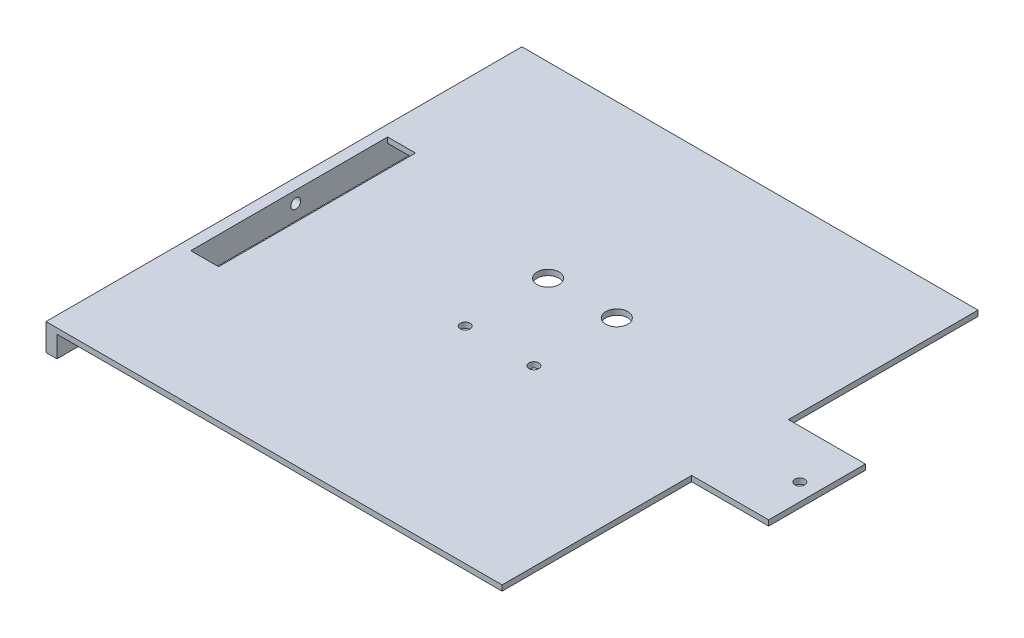
ISO-10303-21;
HEADER;
FILE_DESCRIPTION(('STEP AP214'),'2;1');
FILE_NAME('part.step','',(''),(''),'','','');
FILE_SCHEMA(('AUTOMOTIVE_DESIGN { 1 0 10303 214 1 1 1 1 }'));
ENDSEC;
DATA;
#1=APPLICATION_CONTEXT('core data for automotive mechanical design processes');
#2=APPLICATION_PROTOCOL_DEFINITION('international standard','automotive_design',2000,#1);
#3=PRODUCT_CONTEXT('',#1,'mechanical');
#4=PRODUCT('Part','Part','',(#3));
#5=PRODUCT_RELATED_PRODUCT_CATEGORY('part','',(#4));
#6=PRODUCT_DEFINITION_FORMATION('','',#4);
#7=PRODUCT_DEFINITION_CONTEXT('part definition',#1,'design');
#8=PRODUCT_DEFINITION('design','',#6,#7);
#9=PRODUCT_DEFINITION_SHAPE('','',#8);
#10=(LENGTH_UNIT() NAMED_UNIT(*) SI_UNIT(.MILLI.,.METRE.));
#11=(NAMED_UNIT(*) PLANE_ANGLE_UNIT() SI_UNIT($,.RADIAN.));
#12=(NAMED_UNIT(*) SI_UNIT($,.STERADIAN.) SOLID_ANGLE_UNIT());
#13=UNCERTAINTY_MEASURE_WITH_UNIT(LENGTH_MEASURE(1.E-05),#10,'distance_accuracy_value','');
#14=(GEOMETRIC_REPRESENTATION_CONTEXT(3) GLOBAL_UNCERTAINTY_ASSIGNED_CONTEXT((#13)) GLOBAL_UNIT_ASSIGNED_CONTEXT((#10,
#11,#12)) REPRESENTATION_CONTEXT('',''));
#15=CARTESIAN_POINT('',(0.,0.,0.));
#16=DIRECTION('',(0.,0.,1.));
#17=DIRECTION('',(1.,0.,0.));
#18=AXIS2_PLACEMENT_3D('',#15,#16,#17);
#19=CARTESIAN_POINT('',(-46.9072978588514,0.,24.0778583748593));
#20=DIRECTION('',(0.,0.,-1.));
#21=DIRECTION('',(-1.,0.,0.));
#22=AXIS2_PLACEMENT_3D('',#19,#20,#21);
#23=PLANE('',#22);
#24=DIRECTION('',(-1.,0.,0.));
#25=VECTOR('',#24,1.);
#26=CARTESIAN_POINT('',(-46.9072978588514,0.,24.0778583748593));
#27=LINE('',#26,#25);
#28=CARTESIAN_POINT('',(-46.9072978588514,0.,24.0778583748593));
#29=VERTEX_POINT('',#28);
#30=CARTESIAN_POINT('',(-53.34,0.,24.0778583748593));
#31=VERTEX_POINT('',#30);
#32=EDGE_CURVE('E200',#29,#31,#27,.T.);
#33=ORIENTED_EDGE('',*,*,#32,.T.);
#34=DIRECTION('',(0.,-1.,0.));
#35=VECTOR('',#34,1.);
#36=CARTESIAN_POINT('',(-53.34,0.,24.0778583748593));
#37=LINE('',#36,#35);
#38=CARTESIAN_POINT('',(-53.34,1.27,24.0778583748593));
#39=VERTEX_POINT('',#38);
#40=EDGE_CURVE('E243',#39,#31,#37,.T.);
#41=ORIENTED_EDGE('',*,*,#40,.F.);
#42=DIRECTION('',(1.,0.,0.));
#43=VECTOR('',#42,1.);
#44=CARTESIAN_POINT('',(0.,1.27,24.0778583748593));
#45=LINE('',#44,#43);
#46=CARTESIAN_POINT('',(-46.9072978588514,1.27,24.0778583748593));
#47=VERTEX_POINT('',#46);
#48=EDGE_CURVE('E163',#47,#39,#45,.F.);
#49=ORIENTED_EDGE('',*,*,#48,.F.);
#50=DIRECTION('',(0.,-1.,0.));
#51=VECTOR('',#50,1.);
#52=CARTESIAN_POINT('',(-46.9072978588514,0.,24.0778583748593));
#53=LINE('',#52,#51);
#54=EDGE_CURVE('E11',#47,#29,#53,.T.);
#55=ORIENTED_EDGE('',*,*,#54,.T.);
#56=EDGE_LOOP('',(#33,#41,#49,#55));
#57=FACE_BOUND('',#56,.T.);
#58=ADVANCED_FACE('F36',(#57),#23,.T.);
#59=CARTESIAN_POINT('',(-46.9072978588514,0.,-21.4333957618678));
#60=DIRECTION('',(-1.,0.,0.));
#61=DIRECTION('',(0.,0.,1.));
#62=AXIS2_PLACEMENT_3D('',#59,#60,#61);
#63=PLANE('',#62);
#64=ORIENTED_EDGE('',*,*,#54,.F.);
#65=DIRECTION('',(0.,0.,1.));
#66=VECTOR('',#65,1.);
#67=CARTESIAN_POINT('',(-46.9072978588514,1.27,0.));
#68=LINE('',#67,#66);
#69=CARTESIAN_POINT('',(-46.9072978588514,1.27,-21.4333957618678));
#70=VERTEX_POINT('',#69);
#71=EDGE_CURVE('E182',#70,#47,#68,.T.);
#72=ORIENTED_EDGE('',*,*,#71,.F.);
#73=DIRECTION('',(0.,-1.,0.));
#74=VECTOR('',#73,1.);
#75=CARTESIAN_POINT('',(-46.9072978588514,0.,-21.4333957618678));
#76=LINE('',#75,#74);
#77=CARTESIAN_POINT('',(-46.9072978588514,0.,-21.4333957618678));
#78=VERTEX_POINT('',#77);
#79=EDGE_CURVE('E44',#70,#78,#76,.T.);
#80=ORIENTED_EDGE('',*,*,#79,.T.);
#81=DIRECTION('',(0.,0.,1.));
#82=VECTOR('',#81,1.);
#83=CARTESIAN_POINT('',(-46.9072978588514,0.,-21.4333957618678));
#84=LINE('',#83,#82);
#85=EDGE_CURVE('E194',#78,#29,#84,.T.);
#86=ORIENTED_EDGE('',*,*,#85,.T.);
#87=EDGE_LOOP('',(#64,#72,#80,#86));
#88=FACE_BOUND('',#87,.T.);
#89=ADVANCED_FACE('F193',(#88),#63,.T.);
#90=CARTESIAN_POINT('',(-49.53,0.,-21.4333957618678));
#91=DIRECTION('',(0.,0.,1.));
#92=DIRECTION('',(1.,0.,0.));
#93=AXIS2_PLACEMENT_3D('',#90,#91,#92);
#94=PLANE('',#93);
#95=ORIENTED_EDGE('',*,*,#79,.F.);
#96=DIRECTION('',(1.,0.,0.));
#97=VECTOR('',#96,1.);
#98=CARTESIAN_POINT('',(0.,1.27,-21.4333957618678));
#99=LINE('',#98,#97);
#100=CARTESIAN_POINT('',(-53.34,1.27,-21.4333957618678));
#101=VERTEX_POINT('',#100);
#102=EDGE_CURVE('E180',#101,#70,#99,.T.);
#103=ORIENTED_EDGE('',*,*,#102,.F.);
#104=DIRECTION('',(0.,1.,0.));
#105=VECTOR('',#104,1.);
#106=CARTESIAN_POINT('',(-53.34,0.,-21.4333957618678));
#107=LINE('',#106,#105);
#108=CARTESIAN_POINT('',(-53.34,0.,-21.4333957618678));
#109=VERTEX_POINT('',#108);
#110=EDGE_CURVE('E204',#109,#101,#107,.T.);
#111=ORIENTED_EDGE('',*,*,#110,.F.);
#112=DIRECTION('',(1.,0.,0.));
#113=VECTOR('',#112,1.);
#114=CARTESIAN_POINT('',(-49.53,0.,-21.4333957618678));
#115=LINE('',#114,#113);
#116=EDGE_CURVE('E198',#109,#78,#115,.T.);
#117=ORIENTED_EDGE('',*,*,#116,.T.);
#118=EDGE_LOOP('',(#95,#103,#111,#117));
#119=FACE_BOUND('',#118,.T.);
#120=ADVANCED_FACE('F202',(#119),#94,.T.);
#121=CARTESIAN_POINT('',(-49.53,0.,-54.991));
#122=DIRECTION('',(0.,0.,-1.));
#123=DIRECTION('',(-1.,0.,0.));
#124=AXIS2_PLACEMENT_3D('',#121,#122,#123);
#125=PLANE('',#124);
#126=DIRECTION('',(-1.,0.,0.));
#127=VECTOR('',#126,1.);
#128=CARTESIAN_POINT('',(-49.53,0.,-54.991));
#129=LINE('',#128,#127);
#130=CARTESIAN_POINT('',(49.53,0.,-54.991));
#131=VERTEX_POINT('',#130);
#132=CARTESIAN_POINT('',(-53.34,0.,-54.991));
#133=VERTEX_POINT('',#132);
#134=EDGE_CURVE('E206',#131,#133,#129,.T.);
#135=ORIENTED_EDGE('',*,*,#134,.T.);
#136=DIRECTION('',(0.,-1.,0.));
#137=VECTOR('',#136,1.);
#138=CARTESIAN_POINT('',(-53.34,1.27,-54.991));
#139=LINE('',#138,#137);
#140=CARTESIAN_POINT('',(-53.34,-4.93411036519831,-54.991));
#141=VERTEX_POINT('',#140);
#142=EDGE_CURVE('E280',#133,#141,#139,.T.);
#143=ORIENTED_EDGE('',*,*,#142,.T.);
#144=DIRECTION('',(1.,0.,0.));
#145=VECTOR('',#144,1.);
#146=CARTESIAN_POINT('',(-55.88,-4.93411036519831,-54.991));
#147=LINE('',#146,#145);
#148=CARTESIAN_POINT('',(-55.88,-4.93411036519831,-54.991));
#149=VERTEX_POINT('',#148);
#150=EDGE_CURVE('E296',#149,#141,#147,.T.);
#151=ORIENTED_EDGE('',*,*,#150,.F.);
#152=DIRECTION('',(0.,-1.,0.));
#153=VECTOR('',#152,1.);
#154=CARTESIAN_POINT('',(-55.88,1.27,-54.991));
#155=LINE('',#154,#153);
#156=CARTESIAN_POINT('',(-55.88,1.27,-54.991));
#157=VERTEX_POINT('',#156);
#158=EDGE_CURVE('E325',#157,#149,#155,.T.);
#159=ORIENTED_EDGE('',*,*,#158,.F.);
#160=DIRECTION('',(1.,0.,0.));
#161=VECTOR('',#160,1.);
#162=CARTESIAN_POINT('',(0.,1.27,-54.991));
#163=LINE('',#162,#161);
#164=CARTESIAN_POINT('',(49.53,1.27,-54.991));
#165=VERTEX_POINT('',#164);
#166=EDGE_CURVE('E177',#165,#157,#163,.F.);
#167=ORIENTED_EDGE('',*,*,#166,.F.);
#168=DIRECTION('',(0.,-1.,0.));
#169=VECTOR('',#168,1.);
#170=CARTESIAN_POINT('',(49.53,0.,-54.991));
#171=LINE('',#170,#169);
#172=EDGE_CURVE('E191',#165,#131,#171,.T.);
#173=ORIENTED_EDGE('',*,*,#172,.T.);
#174=EDGE_LOOP('',(#135,#143,#151,#159,#167,#173));
#175=FACE_BOUND('',#174,.T.);
#176=ADVANCED_FACE('F333',(#175),#125,.T.);
#177=CARTESIAN_POINT('',(49.53,0.,-11.176));
#178=DIRECTION('',(1.,0.,0.));
#179=DIRECTION('',(0.,0.,-1.));
#180=AXIS2_PLACEMENT_3D('',#177,#178,#179);
#181=PLANE('',#180);
#182=ORIENTED_EDGE('',*,*,#172,.F.);
#183=DIRECTION('',(0.,0.,1.));
#184=VECTOR('',#183,1.);
#185=CARTESIAN_POINT('',(49.53,1.27,0.));
#186=LINE('',#185,#184);
#187=CARTESIAN_POINT('',(49.53,1.27,-11.176));
#188=VERTEX_POINT('',#187);
#189=EDGE_CURVE('E174',#188,#165,#186,.F.);
#190=ORIENTED_EDGE('',*,*,#189,.F.);
#191=DIRECTION('',(0.,-1.,0.));
#192=VECTOR('',#191,1.);
#193=CARTESIAN_POINT('',(49.53,0.,-11.176));
#194=LINE('',#193,#192);
#195=CARTESIAN_POINT('',(49.53,0.,-11.176));
#196=VERTEX_POINT('',#195);
#197=EDGE_CURVE('E189',#188,#196,#194,.T.);
#198=ORIENTED_EDGE('',*,*,#197,.T.);
#199=DIRECTION('',(0.,0.,-1.));
#200=VECTOR('',#199,1.);
#201=CARTESIAN_POINT('',(49.53,0.,-11.176));
#202=LINE('',#201,#200);
#203=EDGE_CURVE('E209',#196,#131,#202,.T.);
#204=ORIENTED_EDGE('',*,*,#203,.T.);
#205=EDGE_LOOP('',(#182,#190,#198,#204));
#206=FACE_BOUND('',#205,.T.);
#207=ADVANCED_FACE('F442',(#206),#181,.T.);
#208=CARTESIAN_POINT('',(49.53,0.,-11.176));
#209=DIRECTION('',(0.,0.,-1.));
#210=DIRECTION('',(-1.,0.,0.));
#211=AXIS2_PLACEMENT_3D('',#208,#209,#210);
#212=PLANE('',#211);
#213=ORIENTED_EDGE('',*,*,#197,.F.);
#214=DIRECTION('',(1.,0.,0.));
#215=VECTOR('',#214,1.);
#216=CARTESIAN_POINT('',(0.,1.27,-11.176));
#217=LINE('',#216,#215);
#218=CARTESIAN_POINT('',(67.31,1.27,-11.176));
#219=VERTEX_POINT('',#218);
#220=EDGE_CURVE('E171',#219,#188,#217,.F.);
#221=ORIENTED_EDGE('',*,*,#220,.F.);
#222=DIRECTION('',(0.,-1.,0.));
#223=VECTOR('',#222,1.);
#224=CARTESIAN_POINT('',(67.31,0.,-11.176));
#225=LINE('',#224,#223);
#226=CARTESIAN_POINT('',(67.31,0.,-11.176));
#227=VERTEX_POINT('',#226);
#228=EDGE_CURVE('E127',#219,#227,#225,.T.);
#229=ORIENTED_EDGE('',*,*,#228,.T.);
#230=DIRECTION('',(-1.,0.,0.));
#231=VECTOR('',#230,1.);
#232=CARTESIAN_POINT('',(49.53,0.,-11.176));
#233=LINE('',#232,#231);
#234=EDGE_CURVE('E136',#227,#196,#233,.T.);
#235=ORIENTED_EDGE('',*,*,#234,.T.);
#236=EDGE_LOOP('',(#213,#221,#229,#235));
#237=FACE_BOUND('',#236,.T.);
#238=ADVANCED_FACE('F215',(#237),#212,.T.);
#239=CARTESIAN_POINT('',(67.31,0.,-11.176));
#240=DIRECTION('',(1.,0.,0.));
#241=DIRECTION('',(0.,0.,-1.));
#242=AXIS2_PLACEMENT_3D('',#239,#240,#241);
#243=PLANE('',#242);
#244=ORIENTED_EDGE('',*,*,#228,.F.);
#245=DIRECTION('',(0.,0.,1.));
#246=VECTOR('',#245,1.);
#247=CARTESIAN_POINT('',(67.31,1.27,0.));
#248=LINE('',#247,#246);
#249=CARTESIAN_POINT('',(67.31,1.27,11.176));
#250=VERTEX_POINT('',#249);
#251=EDGE_CURVE('E122',#250,#219,#248,.F.);
#252=ORIENTED_EDGE('',*,*,#251,.F.);
#253=DIRECTION('',(0.,-1.,0.));
#254=VECTOR('',#253,1.);
#255=CARTESIAN_POINT('',(67.31,0.,11.176));
#256=LINE('',#255,#254);
#257=CARTESIAN_POINT('',(67.31,0.,11.176));
#258=VERTEX_POINT('',#257);
#259=EDGE_CURVE('E117',#250,#258,#256,.T.);
#260=ORIENTED_EDGE('',*,*,#259,.T.);
#261=DIRECTION('',(0.,0.,-1.));
#262=VECTOR('',#261,1.);
#263=CARTESIAN_POINT('',(67.31,0.,-11.176));
#264=LINE('',#263,#262);
#265=EDGE_CURVE('E120',#258,#227,#264,.T.);
#266=ORIENTED_EDGE('',*,*,#265,.T.);
#267=EDGE_LOOP('',(#244,#252,#260,#266));
#268=FACE_BOUND('',#267,.T.);
#269=ADVANCED_FACE('F119',(#268),#243,.T.);
#270=CARTESIAN_POINT('',(67.31,0.,11.176));
#271=DIRECTION('',(0.,0.,1.));
#272=DIRECTION('',(1.,0.,0.));
#273=AXIS2_PLACEMENT_3D('',#270,#271,#272);
#274=PLANE('',#273);
#275=ORIENTED_EDGE('',*,*,#259,.F.);
#276=DIRECTION('',(1.,0.,0.));
#277=VECTOR('',#276,1.);
#278=CARTESIAN_POINT('',(0.,1.27,11.176));
#279=LINE('',#278,#277);
#280=CARTESIAN_POINT('',(49.53,1.27,11.176));
#281=VERTEX_POINT('',#280);
#282=EDGE_CURVE('E168',#281,#250,#279,.T.);
#283=ORIENTED_EDGE('',*,*,#282,.F.);
#284=DIRECTION('',(0.,-1.,0.));
#285=VECTOR('',#284,1.);
#286=CARTESIAN_POINT('',(49.53,0.,11.176));
#287=LINE('',#286,#285);
#288=CARTESIAN_POINT('',(49.53,0.,11.176));
#289=VERTEX_POINT('',#288);
#290=EDGE_CURVE('E128',#281,#289,#287,.T.);
#291=ORIENTED_EDGE('',*,*,#290,.T.);
#292=DIRECTION('',(1.,0.,0.));
#293=VECTOR('',#292,1.);
#294=CARTESIAN_POINT('',(67.31,0.,11.176));
#295=LINE('',#294,#293);
#296=EDGE_CURVE('E133',#289,#258,#295,.T.);
#297=ORIENTED_EDGE('',*,*,#296,.T.);
#298=EDGE_LOOP('',(#275,#283,#291,#297));
#299=FACE_BOUND('',#298,.T.);
#300=ADVANCED_FACE('F138',(#299),#274,.T.);
#301=CARTESIAN_POINT('',(49.53,0.,54.991));
#302=DIRECTION('',(1.,0.,0.));
#303=DIRECTION('',(0.,0.,-1.));
#304=AXIS2_PLACEMENT_3D('',#301,#302,#303);
#305=PLANE('',#304);
#306=ORIENTED_EDGE('',*,*,#290,.F.);
#307=DIRECTION('',(0.,0.,1.));
#308=VECTOR('',#307,1.);
#309=CARTESIAN_POINT('',(49.53,1.27,0.));
#310=LINE('',#309,#308);
#311=CARTESIAN_POINT('',(49.53,1.27,54.991));
#312=VERTEX_POINT('',#311);
#313=EDGE_CURVE('E164',#312,#281,#310,.F.);
#314=ORIENTED_EDGE('',*,*,#313,.F.);
#315=DIRECTION('',(0.,-1.,0.));
#316=VECTOR('',#315,1.);
#317=CARTESIAN_POINT('',(49.53,0.,54.991));
#318=LINE('',#317,#316);
#319=CARTESIAN_POINT('',(49.53,0.,54.991));
#320=VERTEX_POINT('',#319);
#321=EDGE_CURVE('E52',#312,#320,#318,.T.);
#322=ORIENTED_EDGE('',*,*,#321,.T.);
#323=DIRECTION('',(0.,0.,-1.));
#324=VECTOR('',#323,1.);
#325=CARTESIAN_POINT('',(49.53,0.,54.991));
#326=LINE('',#325,#324);
#327=EDGE_CURVE('E139',#320,#289,#326,.T.);
#328=ORIENTED_EDGE('',*,*,#327,.T.);
#329=EDGE_LOOP('',(#306,#314,#322,#328));
#330=FACE_BOUND('',#329,.T.);
#331=ADVANCED_FACE('F222',(#330),#305,.T.);
#332=CARTESIAN_POINT('',(-49.53,0.,54.991));
#333=DIRECTION('',(0.,0.,1.));
#334=DIRECTION('',(1.,0.,0.));
#335=AXIS2_PLACEMENT_3D('',#332,#333,#334);
#336=PLANE('',#335);
#337=ORIENTED_EDGE('',*,*,#321,.F.);
#338=DIRECTION('',(1.,0.,0.));
#339=VECTOR('',#338,1.);
#340=CARTESIAN_POINT('',(0.,1.27,54.991));
#341=LINE('',#340,#339);
#342=CARTESIAN_POINT('',(-55.88,1.27,54.991));
#343=VERTEX_POINT('',#342);
#344=EDGE_CURVE('E160',#343,#312,#341,.T.);
#345=ORIENTED_EDGE('',*,*,#344,.F.);
#346=DIRECTION('',(0.,1.,0.));
#347=VECTOR('',#346,1.);
#348=CARTESIAN_POINT('',(-55.88,1.27,54.991));
#349=LINE('',#348,#347);
#350=CARTESIAN_POINT('',(-55.88,-4.93411036519831,54.991));
#351=VERTEX_POINT('',#350);
#352=EDGE_CURVE('E294',#351,#343,#349,.T.);
#353=ORIENTED_EDGE('',*,*,#352,.F.);
#354=DIRECTION('',(1.,0.,0.));
#355=VECTOR('',#354,1.);
#356=CARTESIAN_POINT('',(-55.88,-4.93411036519831,54.991));
#357=LINE('',#356,#355);
#358=CARTESIAN_POINT('',(-53.34,-4.93411036519831,54.991));
#359=VERTEX_POINT('',#358);
#360=EDGE_CURVE('E276',#351,#359,#357,.T.);
#361=ORIENTED_EDGE('',*,*,#360,.T.);
#362=DIRECTION('',(0.,1.,0.));
#363=VECTOR('',#362,1.);
#364=CARTESIAN_POINT('',(-53.34,1.27,54.991));
#365=LINE('',#364,#363);
#366=CARTESIAN_POINT('',(-53.34,0.,54.991));
#367=VERTEX_POINT('',#366);
#368=EDGE_CURVE('E272',#359,#367,#365,.T.);
#369=ORIENTED_EDGE('',*,*,#368,.T.);
#370=DIRECTION('',(1.,0.,0.));
#371=VECTOR('',#370,1.);
#372=CARTESIAN_POINT('',(-49.53,0.,54.991));
#373=LINE('',#372,#371);
#374=EDGE_CURVE('E95',#367,#320,#373,.T.);
#375=ORIENTED_EDGE('',*,*,#374,.T.);
#376=EDGE_LOOP('',(#337,#345,#353,#361,#369,#375));
#377=FACE_BOUND('',#376,.T.);
#378=ADVANCED_FACE('F224',(#377),#336,.T.);
#379=CARTESIAN_POINT('',(9.34750000000267,0.,7.46187394608015));
#380=DIRECTION('',(0.,1.,0.));
#381=DIRECTION('',(0.,0.,1.));
#382=AXIS2_PLACEMENT_3D('',#379,#380,#381);
#383=CYLINDRICAL_SURFACE('',#382,1.143);
#384=CARTESIAN_POINT('',(9.34750000000267,0.,7.46187394608015));
#385=DIRECTION('',(0.,1.,0.));
#386=DIRECTION('',(0.,0.,1.));
#387=AXIS2_PLACEMENT_3D('',#384,#385,#386);
#388=CIRCLE('',#387,1.143);
#389=CARTESIAN_POINT('',(9.34750000000267,0.,8.60487394608015));
#390=VERTEX_POINT('',#389);
#391=EDGE_CURVE('E167',#390,#390,#388,.T.);
#392=ORIENTED_EDGE('',*,*,#391,.F.);
#393=EDGE_LOOP('',(#392));
#394=FACE_BOUND('',#393,.T.);
#395=CARTESIAN_POINT('',(9.34750000000267,1.27,7.46187394608015));
#396=DIRECTION('',(0.,1.,0.));
#397=DIRECTION('',(0.,0.,1.));
#398=AXIS2_PLACEMENT_3D('',#395,#396,#397);
#399=CIRCLE('',#398,1.143);
#400=CARTESIAN_POINT('',(9.34750000000267,1.27,8.60487394608015));
#401=VERTEX_POINT('',#400);
#402=EDGE_CURVE('E144',#401,#401,#399,.T.);
#403=ORIENTED_EDGE('',*,*,#402,.T.);
#404=EDGE_LOOP('',(#403));
#405=FACE_BOUND('',#404,.T.);
#406=ADVANCED_FACE('F230',(#394,#405),#383,.F.);
#407=CARTESIAN_POINT('',(-6.52749999999733,0.,-11.6960760539198));
#408=DIRECTION('',(0.,1.,0.));
#409=DIRECTION('',(0.,0.,1.));
#410=AXIS2_PLACEMENT_3D('',#407,#408,#409);
#411=CYLINDRICAL_SURFACE('',#410,2.54);
#412=CARTESIAN_POINT('',(-6.52749999999733,0.,-11.6960760539198));
#413=DIRECTION('',(0.,1.,0.));
#414=DIRECTION('',(0.,0.,1.));
#415=AXIS2_PLACEMENT_3D('',#412,#413,#414);
#416=CIRCLE('',#415,2.54);
#417=CARTESIAN_POINT('',(-6.52749999999733,0.,-9.15607605391985));
#418=VERTEX_POINT('',#417);
#419=EDGE_CURVE('E259',#418,#418,#416,.T.);
#420=ORIENTED_EDGE('',*,*,#419,.F.);
#421=EDGE_LOOP('',(#420));
#422=FACE_BOUND('',#421,.T.);
#423=CARTESIAN_POINT('',(-6.52749999999733,1.27,-11.6960760539198));
#424=DIRECTION('',(0.,1.,0.));
#425=DIRECTION('',(0.,0.,1.));
#426=AXIS2_PLACEMENT_3D('',#423,#424,#425);
#427=CIRCLE('',#426,2.54);
#428=CARTESIAN_POINT('',(-6.52749999999733,1.27,-9.15607605391985));
#429=VERTEX_POINT('',#428);
#430=EDGE_CURVE('E147',#429,#429,#427,.T.);
#431=ORIENTED_EDGE('',*,*,#430,.T.);
#432=EDGE_LOOP('',(#431));
#433=FACE_BOUND('',#432,.T.);
#434=ADVANCED_FACE('F353',(#422,#433),#411,.F.);
#435=CARTESIAN_POINT('',(9.34750000000267,0.,-11.6960760539198));
#436=DIRECTION('',(0.,1.,0.));
#437=DIRECTION('',(0.,0.,1.));
#438=AXIS2_PLACEMENT_3D('',#435,#436,#437);
#439=CYLINDRICAL_SURFACE('',#438,2.54);
#440=CARTESIAN_POINT('',(9.34750000000267,0.,-11.6960760539198));
#441=DIRECTION('',(0.,1.,0.));
#442=DIRECTION('',(0.,0.,1.));
#443=AXIS2_PLACEMENT_3D('',#440,#441,#442);
#444=CIRCLE('',#443,2.54);
#445=CARTESIAN_POINT('',(9.34750000000267,0.,-9.15607605391985));
#446=VERTEX_POINT('',#445);
#447=EDGE_CURVE('E262',#446,#446,#444,.T.);
#448=ORIENTED_EDGE('',*,*,#447,.F.);
#449=EDGE_LOOP('',(#448));
#450=FACE_BOUND('',#449,.T.);
#451=CARTESIAN_POINT('',(9.34750000000267,1.27,-11.6960760539198));
#452=DIRECTION('',(0.,1.,0.));
#453=DIRECTION('',(0.,0.,1.));
#454=AXIS2_PLACEMENT_3D('',#451,#452,#453);
#455=CIRCLE('',#454,2.54);
#456=CARTESIAN_POINT('',(9.34750000000267,1.27,-9.15607605391985));
#457=VERTEX_POINT('',#456);
#458=EDGE_CURVE('E151',#457,#457,#455,.T.);
#459=ORIENTED_EDGE('',*,*,#458,.T.);
#460=EDGE_LOOP('',(#459));
#461=FACE_BOUND('',#460,.T.);
#462=ADVANCED_FACE('F357',(#450,#461),#439,.F.);
#463=CARTESIAN_POINT('',(-6.52749999999733,0.,7.46187394608015));
#464=DIRECTION('',(0.,1.,0.));
#465=DIRECTION('',(0.,0.,1.));
#466=AXIS2_PLACEMENT_3D('',#463,#464,#465);
#467=CYLINDRICAL_SURFACE('',#466,1.143);
#468=CARTESIAN_POINT('',(-6.52749999999733,0.,7.46187394608015));
#469=DIRECTION('',(0.,1.,0.));
#470=DIRECTION('',(0.,0.,1.));
#471=AXIS2_PLACEMENT_3D('',#468,#469,#470);
#472=CIRCLE('',#471,1.143);
#473=CARTESIAN_POINT('',(-6.52749999999733,0.,8.60487394608015));
#474=VERTEX_POINT('',#473);
#475=EDGE_CURVE('E265',#474,#474,#472,.T.);
#476=ORIENTED_EDGE('',*,*,#475,.F.);
#477=EDGE_LOOP('',(#476));
#478=FACE_BOUND('',#477,.T.);
#479=CARTESIAN_POINT('',(-6.52749999999733,1.27,7.46187394608015));
#480=DIRECTION('',(0.,1.,0.));
#481=DIRECTION('',(0.,0.,1.));
#482=AXIS2_PLACEMENT_3D('',#479,#480,#481);
#483=CIRCLE('',#482,1.143);
#484=CARTESIAN_POINT('',(-6.52749999999733,1.27,8.60487394608015));
#485=VERTEX_POINT('',#484);
#486=EDGE_CURVE('E154',#485,#485,#483,.T.);
#487=ORIENTED_EDGE('',*,*,#486,.T.);
#488=EDGE_LOOP('',(#487));
#489=FACE_BOUND('',#488,.T.);
#490=ADVANCED_FACE('F361',(#478,#489),#467,.F.);
#491=CARTESIAN_POINT('',(63.3459490257735,0.,0.));
#492=DIRECTION('',(0.,1.,0.));
#493=DIRECTION('',(0.,0.,1.));
#494=AXIS2_PLACEMENT_3D('',#491,#492,#493);
#495=CYLINDRICAL_SURFACE('',#494,1.143);
#496=CARTESIAN_POINT('',(63.3459490257735,0.,0.));
#497=DIRECTION('',(0.,1.,0.));
#498=DIRECTION('',(0.,0.,1.));
#499=AXIS2_PLACEMENT_3D('',#496,#497,#498);
#500=CIRCLE('',#499,1.143);
#501=CARTESIAN_POINT('',(63.3459490257735,0.,1.14299999999999));
#502=VERTEX_POINT('',#501);
#503=EDGE_CURVE('E268',#502,#502,#500,.T.);
#504=ORIENTED_EDGE('',*,*,#503,.F.);
#505=EDGE_LOOP('',(#504));
#506=FACE_BOUND('',#505,.T.);
#507=CARTESIAN_POINT('',(63.3459490257735,1.27,0.));
#508=DIRECTION('',(0.,1.,0.));
#509=DIRECTION('',(0.,0.,1.));
#510=AXIS2_PLACEMENT_3D('',#507,#508,#509);
#511=CIRCLE('',#510,1.143);
#512=CARTESIAN_POINT('',(63.3459490257735,1.27,1.14299999999999));
#513=VERTEX_POINT('',#512);
#514=EDGE_CURVE('E157',#513,#513,#511,.T.);
#515=ORIENTED_EDGE('',*,*,#514,.T.);
#516=EDGE_LOOP('',(#515));
#517=FACE_BOUND('',#516,.T.);
#518=ADVANCED_FACE('F348',(#506,#517),#495,.F.);
#519=CARTESIAN_POINT('',(0.,0.,0.));
#520=DIRECTION('',(0.,1.,0.));
#521=DIRECTION('',(0.,0.,1.));
#522=AXIS2_PLACEMENT_3D('',#519,#520,#521);
#523=PLANE('',#522);
#524=ORIENTED_EDGE('',*,*,#391,.T.);
#525=EDGE_LOOP('',(#524));
#526=FACE_BOUND('',#525,.T.);
#527=ORIENTED_EDGE('',*,*,#419,.T.);
#528=EDGE_LOOP('',(#527));
#529=FACE_BOUND('',#528,.T.);
#530=ORIENTED_EDGE('',*,*,#447,.T.);
#531=EDGE_LOOP('',(#530));
#532=FACE_BOUND('',#531,.T.);
#533=ORIENTED_EDGE('',*,*,#475,.T.);
#534=EDGE_LOOP('',(#533));
#535=FACE_BOUND('',#534,.T.);
#536=ORIENTED_EDGE('',*,*,#503,.T.);
#537=EDGE_LOOP('',(#536));
#538=FACE_BOUND('',#537,.T.);
#539=ORIENTED_EDGE('',*,*,#374,.F.);
#540=DIRECTION('',(0.,0.,1.));
#541=VECTOR('',#540,1.);
#542=CARTESIAN_POINT('',(-53.34,0.,54.991));
#543=LINE('',#542,#541);
#544=EDGE_CURVE('E148',#31,#367,#543,.T.);
#545=ORIENTED_EDGE('',*,*,#544,.F.);
#546=ORIENTED_EDGE('',*,*,#32,.F.);
#547=ORIENTED_EDGE('',*,*,#85,.F.);
#548=ORIENTED_EDGE('',*,*,#116,.F.);
#549=DIRECTION('',(0.,0.,1.));
#550=VECTOR('',#549,1.);
#551=CARTESIAN_POINT('',(-53.34,0.,-21.4333957618678));
#552=LINE('',#551,#550);
#553=EDGE_CURVE('E252',#133,#109,#552,.T.);
#554=ORIENTED_EDGE('',*,*,#553,.F.);
#555=ORIENTED_EDGE('',*,*,#134,.F.);
#556=ORIENTED_EDGE('',*,*,#203,.F.);
#557=ORIENTED_EDGE('',*,*,#234,.F.);
#558=ORIENTED_EDGE('',*,*,#265,.F.);
#559=ORIENTED_EDGE('',*,*,#296,.F.);
#560=ORIENTED_EDGE('',*,*,#327,.F.);
#561=EDGE_LOOP('',(#539,#545,#546,#547,#548,#554,#555,#556,#557,#558,#559,#560));
#562=FACE_BOUND('',#561,.T.);
#563=ADVANCED_FACE('F132',(#526,#529,#532,#535,#538,#562),#523,.F.);
#564=CARTESIAN_POINT('',(0.,1.27,0.));
#565=DIRECTION('',(0.,1.,0.));
#566=DIRECTION('',(0.,0.,1.));
#567=AXIS2_PLACEMENT_3D('',#564,#565,#566);
#568=PLANE('',#567);
#569=ORIENTED_EDGE('',*,*,#48,.T.);
#570=DIRECTION('',(0.,0.,-1.));
#571=VECTOR('',#570,1.);
#572=CARTESIAN_POINT('',(-53.34,1.27,54.991));
#573=LINE('',#572,#571);
#574=EDGE_CURVE('E251',#39,#101,#573,.T.);
#575=ORIENTED_EDGE('',*,*,#574,.T.);
#576=ORIENTED_EDGE('',*,*,#102,.T.);
#577=ORIENTED_EDGE('',*,*,#71,.T.);
#578=EDGE_LOOP('',(#569,#575,#576,#577));
#579=FACE_BOUND('',#578,.T.);
#580=ORIENTED_EDGE('',*,*,#402,.F.);
#581=EDGE_LOOP('',(#580));
#582=FACE_BOUND('',#581,.T.);
#583=ORIENTED_EDGE('',*,*,#430,.F.);
#584=EDGE_LOOP('',(#583));
#585=FACE_BOUND('',#584,.T.);
#586=ORIENTED_EDGE('',*,*,#458,.F.);
#587=EDGE_LOOP('',(#586));
#588=FACE_BOUND('',#587,.T.);
#589=ORIENTED_EDGE('',*,*,#486,.F.);
#590=EDGE_LOOP('',(#589));
#591=FACE_BOUND('',#590,.T.);
#592=ORIENTED_EDGE('',*,*,#514,.F.);
#593=EDGE_LOOP('',(#592));
#594=FACE_BOUND('',#593,.T.);
#595=ORIENTED_EDGE('',*,*,#344,.T.);
#596=ORIENTED_EDGE('',*,*,#313,.T.);
#597=ORIENTED_EDGE('',*,*,#282,.T.);
#598=ORIENTED_EDGE('',*,*,#251,.T.);
#599=ORIENTED_EDGE('',*,*,#220,.T.);
#600=ORIENTED_EDGE('',*,*,#189,.T.);
#601=ORIENTED_EDGE('',*,*,#166,.T.);
#602=DIRECTION('',(0.,0.,-1.));
#603=VECTOR('',#602,1.);
#604=CARTESIAN_POINT('',(-55.88,1.27,54.991));
#605=LINE('',#604,#603);
#606=EDGE_CURVE('E321',#343,#157,#605,.T.);
#607=ORIENTED_EDGE('',*,*,#606,.F.);
#608=EDGE_LOOP('',(#595,#596,#597,#598,#599,#600,#601,#607));
#609=FACE_BOUND('',#608,.T.);
#610=ADVANCED_FACE('F218',(#579,#582,#585,#588,#591,#594,#609),#568,.T.);
#611=CARTESIAN_POINT('',(-55.88,-4.93411036519831,54.991));
#612=DIRECTION('',(0.,1.,0.));
#613=DIRECTION('',(0.,0.,1.));
#614=AXIS2_PLACEMENT_3D('',#611,#612,#613);
#615=PLANE('',#614);
#616=DIRECTION('',(0.,0.,1.));
#617=VECTOR('',#616,1.);
#618=CARTESIAN_POINT('',(-53.34,-4.93411036519831,54.991));
#619=LINE('',#618,#617);
#620=EDGE_CURVE('E291',#141,#359,#619,.T.);
#621=ORIENTED_EDGE('',*,*,#620,.T.);
#622=ORIENTED_EDGE('',*,*,#360,.F.);
#623=DIRECTION('',(0.,0.,1.));
#624=VECTOR('',#623,1.);
#625=CARTESIAN_POINT('',(-55.88,-4.93411036519831,54.991));
#626=LINE('',#625,#624);
#627=EDGE_CURVE('E286',#149,#351,#626,.T.);
#628=ORIENTED_EDGE('',*,*,#627,.F.);
#629=ORIENTED_EDGE('',*,*,#150,.T.);
#630=EDGE_LOOP('',(#621,#622,#628,#629));
#631=FACE_BOUND('',#630,.T.);
#632=ADVANCED_FACE('F335',(#631),#615,.F.);
#633=CARTESIAN_POINT('',(-55.88,0.,0.));
#634=DIRECTION('',(1.,0.,0.));
#635=DIRECTION('',(0.,0.,-1.));
#636=AXIS2_PLACEMENT_3D('',#633,#634,#635);
#637=PLANE('',#636);
#638=CARTESIAN_POINT('',(-55.88,-1.42881413432716,-0.192674888367617));
#639=DIRECTION('',(-1.,0.,0.));
#640=DIRECTION('',(0.,0.,1.));
#641=AXIS2_PLACEMENT_3D('',#638,#639,#640);
#642=CIRCLE('',#641,1.143);
#643=CARTESIAN_POINT('',(-55.88,-1.42881413432716,0.950325111632383));
#644=VERTEX_POINT('',#643);
#645=EDGE_CURVE('E283',#644,#644,#642,.T.);
#646=ORIENTED_EDGE('',*,*,#645,.F.);
#647=EDGE_LOOP('',(#646));
#648=FACE_BOUND('',#647,.T.);
#649=ORIENTED_EDGE('',*,*,#352,.T.);
#650=ORIENTED_EDGE('',*,*,#606,.T.);
#651=ORIENTED_EDGE('',*,*,#158,.T.);
#652=ORIENTED_EDGE('',*,*,#627,.T.);
#653=EDGE_LOOP('',(#649,#650,#651,#652));
#654=FACE_BOUND('',#653,.T.);
#655=ADVANCED_FACE('F327',(#648,#654),#637,.F.);
#656=CARTESIAN_POINT('',(-53.34,0.,0.));
#657=DIRECTION('',(1.,0.,0.));
#658=DIRECTION('',(0.,0.,-1.));
#659=AXIS2_PLACEMENT_3D('',#656,#657,#658);
#660=PLANE('',#659);
#661=CARTESIAN_POINT('',(-53.34,-1.42881413432716,-0.192674888367618));
#662=DIRECTION('',(-1.,0.,0.));
#663=DIRECTION('',(0.,0.,1.));
#664=AXIS2_PLACEMENT_3D('',#661,#662,#663);
#665=CIRCLE('',#664,1.143);
#666=CARTESIAN_POINT('',(-53.34,-1.42881413432716,0.950325111632382));
#667=VERTEX_POINT('',#666);
#668=EDGE_CURVE('E278',#667,#667,#665,.T.);
#669=ORIENTED_EDGE('',*,*,#668,.T.);
#670=EDGE_LOOP('',(#669));
#671=FACE_BOUND('',#670,.T.);
#672=ORIENTED_EDGE('',*,*,#574,.F.);
#673=ORIENTED_EDGE('',*,*,#40,.T.);
#674=ORIENTED_EDGE('',*,*,#544,.T.);
#675=ORIENTED_EDGE('',*,*,#368,.F.);
#676=ORIENTED_EDGE('',*,*,#620,.F.);
#677=ORIENTED_EDGE('',*,*,#142,.F.);
#678=ORIENTED_EDGE('',*,*,#553,.T.);
#679=ORIENTED_EDGE('',*,*,#110,.T.);
#680=EDGE_LOOP('',(#672,#673,#674,#675,#676,#677,#678,#679));
#681=FACE_BOUND('',#680,.T.);
#682=ADVANCED_FACE('F249',(#671,#681),#660,.T.);
#683=CARTESIAN_POINT('',(-53.34,-1.42881413432716,-0.192674888367618));
#684=DIRECTION('',(-1.,0.,0.));
#685=DIRECTION('',(0.,0.,1.));
#686=AXIS2_PLACEMENT_3D('',#683,#684,#685);
#687=CYLINDRICAL_SURFACE('',#686,1.143);
#688=ORIENTED_EDGE('',*,*,#668,.F.);
#689=EDGE_LOOP('',(#688));
#690=FACE_BOUND('',#689,.T.);
#691=ORIENTED_EDGE('',*,*,#645,.T.);
#692=EDGE_LOOP('',(#691));
#693=FACE_BOUND('',#692,.T.);
#694=ADVANCED_FACE('F407',(#690,#693),#687,.F.);
#695=CLOSED_SHELL('',(#58,#89,#120,#176,#207,#238,#269,#300,#331,#378,#406,#434,#462,#490,#518,
#563,#610,#632,#655,#682,#694));
#696=MANIFOLD_SOLID_BREP('B2',#695);
#697=ADVANCED_BREP_SHAPE_REPRESENTATION('',(#18,#696),#14);
#698=SHAPE_DEFINITION_REPRESENTATION(#9,#697);
ENDSEC;
END-ISO-10303-21;
